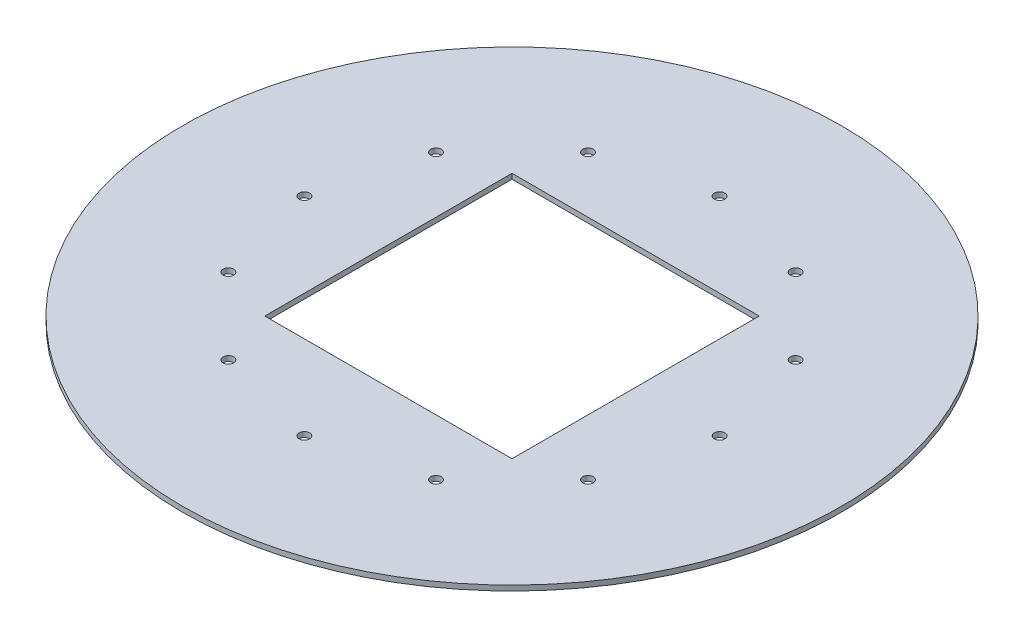
ISO-10303-21;
HEADER;
FILE_DESCRIPTION(('STEP AP214'),'2;1');
FILE_NAME('part.step','',(''),(''),'','','');
FILE_SCHEMA(('AUTOMOTIVE_DESIGN { 1 0 10303 214 1 1 1 1 }'));
ENDSEC;
DATA;
#1=APPLICATION_CONTEXT('core data for automotive mechanical design processes');
#2=APPLICATION_PROTOCOL_DEFINITION('international standard','automotive_design',2000,#1);
#3=PRODUCT_CONTEXT('',#1,'mechanical');
#4=PRODUCT('Part','Part','',(#3));
#5=PRODUCT_RELATED_PRODUCT_CATEGORY('part','',(#4));
#6=PRODUCT_DEFINITION_FORMATION('','',#4);
#7=PRODUCT_DEFINITION_CONTEXT('part definition',#1,'design');
#8=PRODUCT_DEFINITION('design','',#6,#7);
#9=PRODUCT_DEFINITION_SHAPE('','',#8);
#10=(LENGTH_UNIT() NAMED_UNIT(*) SI_UNIT(.MILLI.,.METRE.));
#11=(NAMED_UNIT(*) PLANE_ANGLE_UNIT() SI_UNIT($,.RADIAN.));
#12=(NAMED_UNIT(*) SI_UNIT($,.STERADIAN.) SOLID_ANGLE_UNIT());
#13=UNCERTAINTY_MEASURE_WITH_UNIT(LENGTH_MEASURE(1.E-05),#10,'distance_accuracy_value','');
#14=(GEOMETRIC_REPRESENTATION_CONTEXT(3) GLOBAL_UNCERTAINTY_ASSIGNED_CONTEXT((#13)) GLOBAL_UNIT_ASSIGNED_CONTEXT((#10,
#11,#12)) REPRESENTATION_CONTEXT('',''));
#15=CARTESIAN_POINT('',(0.,0.,0.));
#16=DIRECTION('',(0.,0.,1.));
#17=DIRECTION('',(1.,0.,0.));
#18=AXIS2_PLACEMENT_3D('',#15,#16,#17);
#19=CARTESIAN_POINT('',(-60.,-0.785000000000001,0.));
#20=DIRECTION('',(0.,1.,0.));
#21=DIRECTION('',(0.,0.,1.));
#22=AXIS2_PLACEMENT_3D('',#19,#20,#21);
#23=PLANE('',#22);
#24=CARTESIAN_POINT('',(-54.5596004384197,-0.785000000007585,-31.4999999999999));
#25=DIRECTION('',(0.,1.,0.));
#26=DIRECTION('',(0.86602540378444,0.,0.499999999999998));
#27=AXIS2_PLACEMENT_3D('',#24,#25,#26);
#28=CIRCLE('',#27,1.6);
#29=CARTESIAN_POINT('',(-53.1739597923646,-0.785000000007585,-30.6999999999999));
#30=VERTEX_POINT('',#29);
#31=EDGE_CURVE('E131',#30,#30,#28,.T.);
#32=ORIENTED_EDGE('',*,*,#31,.T.);
#33=EDGE_LOOP('',(#32));
#34=FACE_BOUND('',#33,.T.);
#35=CARTESIAN_POINT('',(-63.,-0.785000000007585,2.19963324347117E-13));
#36=DIRECTION('',(0.,1.,0.));
#37=DIRECTION('',(1.,0.,0.));
#38=AXIS2_PLACEMENT_3D('',#35,#36,#37);
#39=CIRCLE('',#38,1.6);
#40=CARTESIAN_POINT('',(-61.4,-0.785000000007585,2.14376954204968E-13));
#41=VERTEX_POINT('',#40);
#42=EDGE_CURVE('E174',#41,#41,#39,.T.);
#43=ORIENTED_EDGE('',*,*,#42,.T.);
#44=EDGE_LOOP('',(#43));
#45=FACE_BOUND('',#44,.T.);
#46=CARTESIAN_POINT('',(-54.5596004384195,-0.785000000007585,31.5000000000003));
#47=DIRECTION('',(0.,1.,0.));
#48=DIRECTION('',(0.866025403784436,0.,-0.500000000000004));
#49=AXIS2_PLACEMENT_3D('',#46,#47,#48);
#50=CIRCLE('',#49,1.6);
#51=CARTESIAN_POINT('',(-53.1739597923644,-0.785000000007585,30.7000000000002));
#52=VERTEX_POINT('',#51);
#53=EDGE_CURVE('E168',#52,#52,#50,.T.);
#54=ORIENTED_EDGE('',*,*,#53,.T.);
#55=EDGE_LOOP('',(#54));
#56=FACE_BOUND('',#55,.T.);
#57=CARTESIAN_POINT('',(-31.4999999999997,-0.785000000007585,54.5596004384198));
#58=DIRECTION('',(0.,1.,0.));
#59=DIRECTION('',(0.499999999999995,0.,-0.866025403784442));
#60=AXIS2_PLACEMENT_3D('',#57,#58,#59);
#61=CIRCLE('',#60,1.6);
#62=CARTESIAN_POINT('',(-30.6999999999997,-0.785000000007585,53.1739597923647));
#63=VERTEX_POINT('',#62);
#64=EDGE_CURVE('E162',#63,#63,#61,.T.);
#65=ORIENTED_EDGE('',*,*,#64,.T.);
#66=EDGE_LOOP('',(#65));
#67=FACE_BOUND('',#66,.T.);
#68=CARTESIAN_POINT('',(0.,-0.785000000007585,63.));
#69=DIRECTION('',(0.,1.,0.));
#70=DIRECTION('',(0.,0.,-1.));
#71=AXIS2_PLACEMENT_3D('',#68,#69,#70);
#72=CIRCLE('',#71,1.6);
#73=CARTESIAN_POINT('',(0.,-0.785000000007585,61.4));
#74=VERTEX_POINT('',#73);
#75=EDGE_CURVE('E156',#74,#74,#72,.T.);
#76=ORIENTED_EDGE('',*,*,#75,.T.);
#77=EDGE_LOOP('',(#76));
#78=FACE_BOUND('',#77,.T.);
#79=CARTESIAN_POINT('',(31.5000000000005,-0.785000000007585,54.5596004384194));
#80=DIRECTION('',(0.,1.,0.));
#81=DIRECTION('',(-0.500000000000007,0.,-0.866025403784435));
#82=AXIS2_PLACEMENT_3D('',#79,#80,#81);
#83=CIRCLE('',#82,1.6);
#84=CARTESIAN_POINT('',(30.7000000000004,-0.785000000007585,53.1739597923643));
#85=VERTEX_POINT('',#84);
#86=EDGE_CURVE('E150',#85,#85,#83,.T.);
#87=ORIENTED_EDGE('',*,*,#86,.T.);
#88=EDGE_LOOP('',(#87));
#89=FACE_BOUND('',#88,.T.);
#90=CARTESIAN_POINT('',(54.5596004384199,-0.785000000007585,31.4999999999995));
#91=DIRECTION('',(0.,1.,0.));
#92=DIRECTION('',(-0.866025403784443,0.,-0.499999999999992));
#93=AXIS2_PLACEMENT_3D('',#90,#91,#92);
#94=CIRCLE('',#93,1.6);
#95=CARTESIAN_POINT('',(53.1739597923648,-0.785000000007585,30.6999999999995));
#96=VERTEX_POINT('',#95);
#97=EDGE_CURVE('E144',#96,#96,#94,.T.);
#98=ORIENTED_EDGE('',*,*,#97,.T.);
#99=EDGE_LOOP('',(#98));
#100=FACE_BOUND('',#99,.T.);
#101=CARTESIAN_POINT('',(63.,-0.785000000007585,-6.59889973041352E-13));
#102=DIRECTION('',(0.,1.,0.));
#103=DIRECTION('',(-1.,0.,0.));
#104=AXIS2_PLACEMENT_3D('',#101,#102,#103);
#105=CIRCLE('',#104,1.6);
#106=CARTESIAN_POINT('',(61.4,-0.785000000007585,-6.43130862614905E-13));
#107=VERTEX_POINT('',#106);
#108=EDGE_CURVE('E137',#107,#107,#105,.T.);
#109=ORIENTED_EDGE('',*,*,#108,.T.);
#110=EDGE_LOOP('',(#109));
#111=FACE_BOUND('',#110,.T.);
#112=CARTESIAN_POINT('',(54.5596004384193,-0.785000000007585,-31.5000000000006));
#113=DIRECTION('',(0.,1.,0.));
#114=DIRECTION('',(-0.866025403784433,0.,0.50000000000001));
#115=AXIS2_PLACEMENT_3D('',#112,#113,#114);
#116=CIRCLE('',#115,1.6);
#117=CARTESIAN_POINT('',(53.1739597923642,-0.785000000007585,-30.7000000000006));
#118=VERTEX_POINT('',#117);
#119=EDGE_CURVE('E138',#118,#118,#116,.T.);
#120=ORIENTED_EDGE('',*,*,#119,.T.);
#121=EDGE_LOOP('',(#120));
#122=FACE_BOUND('',#121,.T.);
#123=CARTESIAN_POINT('',(31.4999999999993,-0.785000000007585,-54.55960043842));
#124=DIRECTION('',(0.,1.,0.));
#125=DIRECTION('',(-0.499999999999989,0.,0.866025403784445));
#126=AXIS2_PLACEMENT_3D('',#123,#124,#125);
#127=CIRCLE('',#126,1.6);
#128=CARTESIAN_POINT('',(30.6999999999993,-0.785000000007585,-53.1739597923649));
#129=VERTEX_POINT('',#128);
#130=EDGE_CURVE('E185',#129,#129,#127,.T.);
#131=ORIENTED_EDGE('',*,*,#130,.T.);
#132=EDGE_LOOP('',(#131));
#133=FACE_BOUND('',#132,.T.);
#134=CARTESIAN_POINT('',(-31.5000000000001,-0.785000000007585,-54.5596004384196));
#135=DIRECTION('',(0.,1.,0.));
#136=DIRECTION('',(0.500000000000001,0.,0.866025403784438));
#137=AXIS2_PLACEMENT_3D('',#134,#135,#136);
#138=CIRCLE('',#137,1.6);
#139=CARTESIAN_POINT('',(-30.7000000000001,-0.785000000007585,-53.1739597923645));
#140=VERTEX_POINT('',#139);
#141=EDGE_CURVE('E126',#140,#140,#138,.T.);
#142=ORIENTED_EDGE('',*,*,#141,.T.);
#143=EDGE_LOOP('',(#142));
#144=FACE_BOUND('',#143,.T.);
#145=CARTESIAN_POINT('',(0.,-0.785000000007585,-63.));
#146=DIRECTION('',(0.,1.,0.));
#147=DIRECTION('',(0.,0.,1.));
#148=AXIS2_PLACEMENT_3D('',#145,#146,#147);
#149=CIRCLE('',#148,1.6);
#150=CARTESIAN_POINT('',(0.,-0.785000000007585,-61.4));
#151=VERTEX_POINT('',#150);
#152=EDGE_CURVE('E120',#151,#151,#149,.T.);
#153=ORIENTED_EDGE('',*,*,#152,.T.);
#154=EDGE_LOOP('',(#153));
#155=FACE_BOUND('',#154,.T.);
#156=CARTESIAN_POINT('',(0.,-0.785000000007585,0.));
#157=DIRECTION('',(0.,-1.,0.));
#158=DIRECTION('',(0.,0.,-1.));
#159=AXIS2_PLACEMENT_3D('',#156,#157,#158);
#160=CIRCLE('',#159,100.);
#161=CARTESIAN_POINT('',(0.,-0.785000000007585,-100.));
#162=VERTEX_POINT('',#161);
#163=EDGE_CURVE('E11',#162,#162,#160,.T.);
#164=ORIENTED_EDGE('',*,*,#163,.T.);
#165=EDGE_LOOP('',(#164));
#166=FACE_BOUND('',#165,.T.);
#167=DIRECTION('',(1.,0.,0.));
#168=VECTOR('',#167,1.);
#169=CARTESIAN_POINT('',(-37.5,-0.785000000000008,-37.5));
#170=LINE('',#169,#168);
#171=CARTESIAN_POINT('',(-37.5,-0.785000000000008,-37.5));
#172=VERTEX_POINT('',#171);
#173=CARTESIAN_POINT('',(37.5,-0.785000000000008,-37.5));
#174=VERTEX_POINT('',#173);
#175=EDGE_CURVE('E53',#172,#174,#170,.T.);
#176=ORIENTED_EDGE('',*,*,#175,.F.);
#177=DIRECTION('',(0.,0.,-1.));
#178=VECTOR('',#177,1.);
#179=CARTESIAN_POINT('',(-37.5,-0.785000000000008,37.5));
#180=LINE('',#179,#178);
#181=CARTESIAN_POINT('',(-37.5,-0.785000000000008,37.5));
#182=VERTEX_POINT('',#181);
#183=EDGE_CURVE('E57',#182,#172,#180,.T.);
#184=ORIENTED_EDGE('',*,*,#183,.F.);
#185=DIRECTION('',(-1.,0.,0.));
#186=VECTOR('',#185,1.);
#187=CARTESIAN_POINT('',(-37.5,-0.785000000000008,37.5));
#188=LINE('',#187,#186);
#189=CARTESIAN_POINT('',(37.5,-0.785000000000008,37.5));
#190=VERTEX_POINT('',#189);
#191=EDGE_CURVE('E111',#190,#182,#188,.T.);
#192=ORIENTED_EDGE('',*,*,#191,.F.);
#193=DIRECTION('',(0.,0.,1.));
#194=VECTOR('',#193,1.);
#195=CARTESIAN_POINT('',(37.5,-0.785000000000008,37.5));
#196=LINE('',#195,#194);
#197=EDGE_CURVE('E107',#174,#190,#196,.T.);
#198=ORIENTED_EDGE('',*,*,#197,.F.);
#199=EDGE_LOOP('',(#176,#184,#192,#198));
#200=FACE_BOUND('',#199,.T.);
#201=ADVANCED_FACE('F39',(#34,#45,#56,#67,#78,#89,#100,#111,#122,#133,#144,#155,#166,#200),#23,.F.);
#202=CARTESIAN_POINT('',(0.,-200069.047495165,0.));
#203=DIRECTION('',(0.,-1.,0.));
#204=DIRECTION('',(0.,0.,-1.));
#205=AXIS2_PLACEMENT_3D('',#202,#203,#204);
#206=CYLINDRICAL_SURFACE('',#205,100.);
#207=ORIENTED_EDGE('',*,*,#163,.F.);
#208=EDGE_LOOP('',(#207));
#209=FACE_BOUND('',#208,.T.);
#210=CARTESIAN_POINT('',(0.,0.785000000007585,0.));
#211=DIRECTION('',(0.,-1.,0.));
#212=DIRECTION('',(0.,0.,-1.));
#213=AXIS2_PLACEMENT_3D('',#210,#211,#212);
#214=CIRCLE('',#213,100.);
#215=CARTESIAN_POINT('',(0.,0.785000000007585,-100.));
#216=VERTEX_POINT('',#215);
#217=EDGE_CURVE('E46',#216,#216,#214,.T.);
#218=ORIENTED_EDGE('',*,*,#217,.T.);
#219=EDGE_LOOP('',(#218));
#220=FACE_BOUND('',#219,.T.);
#221=ADVANCED_FACE('F206',(#209,#220),#206,.T.);
#222=CARTESIAN_POINT('',(-60.,0.785000000000001,0.));
#223=DIRECTION('',(0.,-1.,0.));
#224=DIRECTION('',(0.,0.,-1.));
#225=AXIS2_PLACEMENT_3D('',#222,#223,#224);
#226=PLANE('',#225);
#227=CARTESIAN_POINT('',(-54.5596004384197,0.785000000000001,-31.4999999999999));
#228=DIRECTION('',(0.,1.,0.));
#229=DIRECTION('',(0.86602540378444,0.,0.499999999999998));
#230=AXIS2_PLACEMENT_3D('',#227,#228,#229);
#231=CIRCLE('',#230,1.6);
#232=CARTESIAN_POINT('',(-53.1739597923646,0.785000000000001,-30.6999999999999));
#233=VERTEX_POINT('',#232);
#234=EDGE_CURVE('E177',#233,#233,#231,.T.);
#235=ORIENTED_EDGE('',*,*,#234,.F.);
#236=EDGE_LOOP('',(#235));
#237=FACE_BOUND('',#236,.T.);
#238=CARTESIAN_POINT('',(-63.,0.785000000000001,2.19963324347117E-13));
#239=DIRECTION('',(0.,1.,0.));
#240=DIRECTION('',(1.,0.,0.));
#241=AXIS2_PLACEMENT_3D('',#238,#239,#240);
#242=CIRCLE('',#241,1.6);
#243=CARTESIAN_POINT('',(-61.4,0.785000000000001,2.14376954204968E-13));
#244=VERTEX_POINT('',#243);
#245=EDGE_CURVE('E171',#244,#244,#242,.T.);
#246=ORIENTED_EDGE('',*,*,#245,.F.);
#247=EDGE_LOOP('',(#246));
#248=FACE_BOUND('',#247,.T.);
#249=CARTESIAN_POINT('',(-54.5596004384195,0.785000000000001,31.5000000000003));
#250=DIRECTION('',(0.,1.,0.));
#251=DIRECTION('',(0.866025403784436,0.,-0.500000000000004));
#252=AXIS2_PLACEMENT_3D('',#249,#250,#251);
#253=CIRCLE('',#252,1.6);
#254=CARTESIAN_POINT('',(-53.1739597923644,0.785000000000001,30.7000000000002));
#255=VERTEX_POINT('',#254);
#256=EDGE_CURVE('E165',#255,#255,#253,.T.);
#257=ORIENTED_EDGE('',*,*,#256,.F.);
#258=EDGE_LOOP('',(#257));
#259=FACE_BOUND('',#258,.T.);
#260=CARTESIAN_POINT('',(-31.4999999999997,0.785000000000001,54.5596004384198));
#261=DIRECTION('',(0.,1.,0.));
#262=DIRECTION('',(0.499999999999995,0.,-0.866025403784442));
#263=AXIS2_PLACEMENT_3D('',#260,#261,#262);
#264=CIRCLE('',#263,1.6);
#265=CARTESIAN_POINT('',(-30.6999999999997,0.785000000000001,53.1739597923647));
#266=VERTEX_POINT('',#265);
#267=EDGE_CURVE('E159',#266,#266,#264,.T.);
#268=ORIENTED_EDGE('',*,*,#267,.F.);
#269=EDGE_LOOP('',(#268));
#270=FACE_BOUND('',#269,.T.);
#271=CARTESIAN_POINT('',(0.,0.785000000000001,63.));
#272=DIRECTION('',(0.,1.,0.));
#273=DIRECTION('',(0.,0.,-1.));
#274=AXIS2_PLACEMENT_3D('',#271,#272,#273);
#275=CIRCLE('',#274,1.6);
#276=CARTESIAN_POINT('',(0.,0.785000000000001,61.4));
#277=VERTEX_POINT('',#276);
#278=EDGE_CURVE('E153',#277,#277,#275,.T.);
#279=ORIENTED_EDGE('',*,*,#278,.F.);
#280=EDGE_LOOP('',(#279));
#281=FACE_BOUND('',#280,.T.);
#282=CARTESIAN_POINT('',(31.5000000000005,0.785000000000001,54.5596004384194));
#283=DIRECTION('',(0.,1.,0.));
#284=DIRECTION('',(-0.500000000000007,0.,-0.866025403784435));
#285=AXIS2_PLACEMENT_3D('',#282,#283,#284);
#286=CIRCLE('',#285,1.6);
#287=CARTESIAN_POINT('',(30.7000000000004,0.785000000000001,53.1739597923643));
#288=VERTEX_POINT('',#287);
#289=EDGE_CURVE('E147',#288,#288,#286,.T.);
#290=ORIENTED_EDGE('',*,*,#289,.F.);
#291=EDGE_LOOP('',(#290));
#292=FACE_BOUND('',#291,.T.);
#293=CARTESIAN_POINT('',(54.5596004384199,0.785000000000001,31.4999999999995));
#294=DIRECTION('',(0.,1.,0.));
#295=DIRECTION('',(-0.866025403784443,0.,-0.499999999999992));
#296=AXIS2_PLACEMENT_3D('',#293,#294,#295);
#297=CIRCLE('',#296,1.6);
#298=CARTESIAN_POINT('',(53.1739597923648,0.785000000000001,30.6999999999995));
#299=VERTEX_POINT('',#298);
#300=EDGE_CURVE('E141',#299,#299,#297,.T.);
#301=ORIENTED_EDGE('',*,*,#300,.F.);
#302=EDGE_LOOP('',(#301));
#303=FACE_BOUND('',#302,.T.);
#304=CARTESIAN_POINT('',(63.,0.785000000000001,-6.59889973041352E-13));
#305=DIRECTION('',(0.,1.,0.));
#306=DIRECTION('',(-1.,0.,0.));
#307=AXIS2_PLACEMENT_3D('',#304,#305,#306);
#308=CIRCLE('',#307,1.6);
#309=CARTESIAN_POINT('',(61.4,0.785000000000001,-6.43130862614905E-13));
#310=VERTEX_POINT('',#309);
#311=EDGE_CURVE('E134',#310,#310,#308,.T.);
#312=ORIENTED_EDGE('',*,*,#311,.F.);
#313=EDGE_LOOP('',(#312));
#314=FACE_BOUND('',#313,.T.);
#315=CARTESIAN_POINT('',(54.5596004384193,0.785000000000001,-31.5000000000006));
#316=DIRECTION('',(0.,1.,0.));
#317=DIRECTION('',(-0.866025403784433,0.,0.50000000000001));
#318=AXIS2_PLACEMENT_3D('',#315,#316,#317);
#319=CIRCLE('',#318,1.6);
#320=CARTESIAN_POINT('',(53.1739597923642,0.785000000000001,-30.7000000000006));
#321=VERTEX_POINT('',#320);
#322=EDGE_CURVE('E188',#321,#321,#319,.T.);
#323=ORIENTED_EDGE('',*,*,#322,.F.);
#324=EDGE_LOOP('',(#323));
#325=FACE_BOUND('',#324,.T.);
#326=CARTESIAN_POINT('',(31.4999999999993,0.785000000000001,-54.55960043842));
#327=DIRECTION('',(0.,1.,0.));
#328=DIRECTION('',(-0.499999999999989,0.,0.866025403784445));
#329=AXIS2_PLACEMENT_3D('',#326,#327,#328);
#330=CIRCLE('',#329,1.6);
#331=CARTESIAN_POINT('',(30.6999999999993,0.785000000000001,-53.1739597923649));
#332=VERTEX_POINT('',#331);
#333=EDGE_CURVE('E182',#332,#332,#330,.T.);
#334=ORIENTED_EDGE('',*,*,#333,.F.);
#335=EDGE_LOOP('',(#334));
#336=FACE_BOUND('',#335,.T.);
#337=CARTESIAN_POINT('',(-31.5000000000001,0.785000000000001,-54.5596004384196));
#338=DIRECTION('',(0.,1.,0.));
#339=DIRECTION('',(0.500000000000001,0.,0.866025403784438));
#340=AXIS2_PLACEMENT_3D('',#337,#338,#339);
#341=CIRCLE('',#340,1.6);
#342=CARTESIAN_POINT('',(-30.7000000000001,0.785000000000001,-53.1739597923645));
#343=VERTEX_POINT('',#342);
#344=EDGE_CURVE('E128',#343,#343,#341,.T.);
#345=ORIENTED_EDGE('',*,*,#344,.F.);
#346=EDGE_LOOP('',(#345));
#347=FACE_BOUND('',#346,.T.);
#348=CARTESIAN_POINT('',(0.,0.785000000000001,-63.));
#349=DIRECTION('',(0.,1.,0.));
#350=DIRECTION('',(0.,0.,1.));
#351=AXIS2_PLACEMENT_3D('',#348,#349,#350);
#352=CIRCLE('',#351,1.6);
#353=CARTESIAN_POINT('',(0.,0.785000000000001,-61.4));
#354=VERTEX_POINT('',#353);
#355=EDGE_CURVE('E116',#354,#354,#352,.T.);
#356=ORIENTED_EDGE('',*,*,#355,.F.);
#357=EDGE_LOOP('',(#356));
#358=FACE_BOUND('',#357,.T.);
#359=ORIENTED_EDGE('',*,*,#217,.F.);
#360=EDGE_LOOP('',(#359));
#361=FACE_BOUND('',#360,.T.);
#362=DIRECTION('',(0.,0.,-1.));
#363=VECTOR('',#362,1.);
#364=CARTESIAN_POINT('',(37.5,0.785000000000001,37.5));
#365=LINE('',#364,#363);
#366=CARTESIAN_POINT('',(37.5,0.785000000000001,37.5));
#367=VERTEX_POINT('',#366);
#368=CARTESIAN_POINT('',(37.5,0.785000000000001,-37.5));
#369=VERTEX_POINT('',#368);
#370=EDGE_CURVE('E94',#367,#369,#365,.T.);
#371=ORIENTED_EDGE('',*,*,#370,.F.);
#372=DIRECTION('',(1.,0.,0.));
#373=VECTOR('',#372,1.);
#374=CARTESIAN_POINT('',(-37.5,0.785000000000001,37.5));
#375=LINE('',#374,#373);
#376=CARTESIAN_POINT('',(-37.5,0.785000000000001,37.5));
#377=VERTEX_POINT('',#376);
#378=EDGE_CURVE('E98',#377,#367,#375,.T.);
#379=ORIENTED_EDGE('',*,*,#378,.F.);
#380=DIRECTION('',(0.,0.,1.));
#381=VECTOR('',#380,1.);
#382=CARTESIAN_POINT('',(-37.5,0.785000000000001,37.5));
#383=LINE('',#382,#381);
#384=CARTESIAN_POINT('',(-37.5,0.785000000000001,-37.5));
#385=VERTEX_POINT('',#384);
#386=EDGE_CURVE('E81',#385,#377,#383,.T.);
#387=ORIENTED_EDGE('',*,*,#386,.F.);
#388=DIRECTION('',(-1.,0.,0.));
#389=VECTOR('',#388,1.);
#390=CARTESIAN_POINT('',(-37.5,0.785000000000001,-37.5));
#391=LINE('',#390,#389);
#392=EDGE_CURVE('E88',#369,#385,#391,.T.);
#393=ORIENTED_EDGE('',*,*,#392,.F.);
#394=EDGE_LOOP('',(#371,#379,#387,#393));
#395=FACE_BOUND('',#394,.T.);
#396=ADVANCED_FACE('F96',(#237,#248,#259,#270,#281,#292,#303,#314,#325,#336,#347,#358,#361,
#395),#226,.F.);
#397=CARTESIAN_POINT('',(-37.5,-170.490627484771,-37.5));
#398=DIRECTION('',(0.,0.,-1.));
#399=DIRECTION('',(-1.,0.,0.));
#400=AXIS2_PLACEMENT_3D('',#397,#398,#399);
#401=PLANE('',#400);
#402=DIRECTION('',(0.,1.,0.));
#403=VECTOR('',#402,1.);
#404=CARTESIAN_POINT('',(-37.5,-170.490627484771,-37.5));
#405=LINE('',#404,#403);
#406=EDGE_CURVE('E77',#172,#385,#405,.T.);
#407=ORIENTED_EDGE('',*,*,#406,.F.);
#408=ORIENTED_EDGE('',*,*,#175,.T.);
#409=DIRECTION('',(0.,1.,0.));
#410=VECTOR('',#409,1.);
#411=CARTESIAN_POINT('',(37.5,-170.490627484771,-37.5));
#412=LINE('',#411,#410);
#413=EDGE_CURVE('E85',#174,#369,#412,.T.);
#414=ORIENTED_EDGE('',*,*,#413,.T.);
#415=ORIENTED_EDGE('',*,*,#392,.T.);
#416=EDGE_LOOP('',(#407,#408,#414,#415));
#417=FACE_BOUND('',#416,.T.);
#418=ADVANCED_FACE('F89',(#417),#401,.F.);
#419=CARTESIAN_POINT('',(-37.5,-170.490627484771,37.5));
#420=DIRECTION('',(-1.,0.,0.));
#421=DIRECTION('',(0.,0.,1.));
#422=AXIS2_PLACEMENT_3D('',#419,#420,#421);
#423=PLANE('',#422);
#424=DIRECTION('',(0.,1.,0.));
#425=VECTOR('',#424,1.);
#426=CARTESIAN_POINT('',(-37.5,-170.490627484771,37.5));
#427=LINE('',#426,#425);
#428=EDGE_CURVE('E84',#182,#377,#427,.T.);
#429=ORIENTED_EDGE('',*,*,#428,.F.);
#430=ORIENTED_EDGE('',*,*,#183,.T.);
#431=ORIENTED_EDGE('',*,*,#406,.T.);
#432=ORIENTED_EDGE('',*,*,#386,.T.);
#433=EDGE_LOOP('',(#429,#430,#431,#432));
#434=FACE_BOUND('',#433,.T.);
#435=ADVANCED_FACE('F79',(#434),#423,.F.);
#436=CARTESIAN_POINT('',(-37.5,-170.490627484771,37.5));
#437=DIRECTION('',(0.,0.,1.));
#438=DIRECTION('',(1.,0.,0.));
#439=AXIS2_PLACEMENT_3D('',#436,#437,#438);
#440=PLANE('',#439);
#441=DIRECTION('',(0.,1.,0.));
#442=VECTOR('',#441,1.);
#443=CARTESIAN_POINT('',(37.5,-170.490627484771,37.5));
#444=LINE('',#443,#442);
#445=EDGE_CURVE('E103',#190,#367,#444,.T.);
#446=ORIENTED_EDGE('',*,*,#445,.F.);
#447=ORIENTED_EDGE('',*,*,#191,.T.);
#448=ORIENTED_EDGE('',*,*,#428,.T.);
#449=ORIENTED_EDGE('',*,*,#378,.T.);
#450=EDGE_LOOP('',(#446,#447,#448,#449));
#451=FACE_BOUND('',#450,.T.);
#452=ADVANCED_FACE('F229',(#451),#440,.F.);
#453=CARTESIAN_POINT('',(37.5,-170.490627484771,37.5));
#454=DIRECTION('',(1.,0.,0.));
#455=DIRECTION('',(0.,0.,-1.));
#456=AXIS2_PLACEMENT_3D('',#453,#454,#455);
#457=PLANE('',#456);
#458=ORIENTED_EDGE('',*,*,#413,.F.);
#459=ORIENTED_EDGE('',*,*,#197,.T.);
#460=ORIENTED_EDGE('',*,*,#445,.T.);
#461=ORIENTED_EDGE('',*,*,#370,.T.);
#462=EDGE_LOOP('',(#458,#459,#460,#461));
#463=FACE_BOUND('',#462,.T.);
#464=ADVANCED_FACE('F219',(#463),#457,.F.);
#465=CARTESIAN_POINT('',(0.,-0.785000000007585,-63.));
#466=DIRECTION('',(0.,1.,0.));
#467=DIRECTION('',(0.,0.,1.));
#468=AXIS2_PLACEMENT_3D('',#465,#466,#467);
#469=CYLINDRICAL_SURFACE('',#468,1.6);
#470=ORIENTED_EDGE('',*,*,#152,.F.);
#471=EDGE_LOOP('',(#470));
#472=FACE_BOUND('',#471,.T.);
#473=ORIENTED_EDGE('',*,*,#355,.T.);
#474=EDGE_LOOP('',(#473));
#475=FACE_BOUND('',#474,.T.);
#476=ADVANCED_FACE('F216',(#472,#475),#469,.F.);
#477=CARTESIAN_POINT('',(-31.5000000000001,-0.785000000007585,-54.5596004384196));
#478=DIRECTION('',(0.,1.,0.));
#479=DIRECTION('',(0.,0.,1.));
#480=AXIS2_PLACEMENT_3D('',#477,#478,#479);
#481=CYLINDRICAL_SURFACE('',#480,1.6);
#482=ORIENTED_EDGE('',*,*,#141,.F.);
#483=EDGE_LOOP('',(#482));
#484=FACE_BOUND('',#483,.T.);
#485=ORIENTED_EDGE('',*,*,#344,.T.);
#486=EDGE_LOOP('',(#485));
#487=FACE_BOUND('',#486,.T.);
#488=ADVANCED_FACE('F218',(#484,#487),#481,.F.);
#489=CARTESIAN_POINT('',(31.4999999999993,-0.785000000007585,-54.55960043842));
#490=DIRECTION('',(0.,1.,0.));
#491=DIRECTION('',(0.,0.,1.));
#492=AXIS2_PLACEMENT_3D('',#489,#490,#491);
#493=CYLINDRICAL_SURFACE('',#492,1.6);
#494=ORIENTED_EDGE('',*,*,#130,.F.);
#495=EDGE_LOOP('',(#494));
#496=FACE_BOUND('',#495,.T.);
#497=ORIENTED_EDGE('',*,*,#333,.T.);
#498=EDGE_LOOP('',(#497));
#499=FACE_BOUND('',#498,.T.);
#500=ADVANCED_FACE('F200',(#496,#499),#493,.F.);
#501=CARTESIAN_POINT('',(54.5596004384193,-0.785000000007585,-31.5000000000006));
#502=DIRECTION('',(0.,1.,0.));
#503=DIRECTION('',(0.,0.,1.));
#504=AXIS2_PLACEMENT_3D('',#501,#502,#503);
#505=CYLINDRICAL_SURFACE('',#504,1.6);
#506=ORIENTED_EDGE('',*,*,#119,.F.);
#507=EDGE_LOOP('',(#506));
#508=FACE_BOUND('',#507,.T.);
#509=ORIENTED_EDGE('',*,*,#322,.T.);
#510=EDGE_LOOP('',(#509));
#511=FACE_BOUND('',#510,.T.);
#512=ADVANCED_FACE('F196',(#508,#511),#505,.F.);
#513=CARTESIAN_POINT('',(63.,-0.785000000007585,-6.59889973041352E-13));
#514=DIRECTION('',(0.,1.,0.));
#515=DIRECTION('',(0.,0.,1.));
#516=AXIS2_PLACEMENT_3D('',#513,#514,#515);
#517=CYLINDRICAL_SURFACE('',#516,1.6);
#518=ORIENTED_EDGE('',*,*,#108,.F.);
#519=EDGE_LOOP('',(#518));
#520=FACE_BOUND('',#519,.T.);
#521=ORIENTED_EDGE('',*,*,#311,.T.);
#522=EDGE_LOOP('',(#521));
#523=FACE_BOUND('',#522,.T.);
#524=ADVANCED_FACE('F199',(#520,#523),#517,.F.);
#525=CARTESIAN_POINT('',(54.5596004384199,-0.785000000007585,31.4999999999995));
#526=DIRECTION('',(0.,1.,0.));
#527=DIRECTION('',(0.,0.,1.));
#528=AXIS2_PLACEMENT_3D('',#525,#526,#527);
#529=CYLINDRICAL_SURFACE('',#528,1.6);
#530=ORIENTED_EDGE('',*,*,#97,.F.);
#531=EDGE_LOOP('',(#530));
#532=FACE_BOUND('',#531,.T.);
#533=ORIENTED_EDGE('',*,*,#300,.T.);
#534=EDGE_LOOP('',(#533));
#535=FACE_BOUND('',#534,.T.);
#536=ADVANCED_FACE('F255',(#532,#535),#529,.F.);
#537=CARTESIAN_POINT('',(31.5000000000005,-0.785000000007585,54.5596004384194));
#538=DIRECTION('',(0.,1.,0.));
#539=DIRECTION('',(0.,0.,1.));
#540=AXIS2_PLACEMENT_3D('',#537,#538,#539);
#541=CYLINDRICAL_SURFACE('',#540,1.6);
#542=ORIENTED_EDGE('',*,*,#86,.F.);
#543=EDGE_LOOP('',(#542));
#544=FACE_BOUND('',#543,.T.);
#545=ORIENTED_EDGE('',*,*,#289,.T.);
#546=EDGE_LOOP('',(#545));
#547=FACE_BOUND('',#546,.T.);
#548=ADVANCED_FACE('F262',(#544,#547),#541,.F.);
#549=CARTESIAN_POINT('',(0.,-0.785000000007585,63.));
#550=DIRECTION('',(0.,1.,0.));
#551=DIRECTION('',(0.,0.,1.));
#552=AXIS2_PLACEMENT_3D('',#549,#550,#551);
#553=CYLINDRICAL_SURFACE('',#552,1.6);
#554=ORIENTED_EDGE('',*,*,#75,.F.);
#555=EDGE_LOOP('',(#554));
#556=FACE_BOUND('',#555,.T.);
#557=ORIENTED_EDGE('',*,*,#278,.T.);
#558=EDGE_LOOP('',(#557));
#559=FACE_BOUND('',#558,.T.);
#560=ADVANCED_FACE('F268',(#556,#559),#553,.F.);
#561=CARTESIAN_POINT('',(-31.4999999999997,-0.785000000007585,54.5596004384198));
#562=DIRECTION('',(0.,1.,0.));
#563=DIRECTION('',(0.,0.,1.));
#564=AXIS2_PLACEMENT_3D('',#561,#562,#563);
#565=CYLINDRICAL_SURFACE('',#564,1.6);
#566=ORIENTED_EDGE('',*,*,#64,.F.);
#567=EDGE_LOOP('',(#566));
#568=FACE_BOUND('',#567,.T.);
#569=ORIENTED_EDGE('',*,*,#267,.T.);
#570=EDGE_LOOP('',(#569));
#571=FACE_BOUND('',#570,.T.);
#572=ADVANCED_FACE('F272',(#568,#571),#565,.F.);
#573=CARTESIAN_POINT('',(-54.5596004384195,-0.785000000007585,31.5000000000003));
#574=DIRECTION('',(0.,1.,0.));
#575=DIRECTION('',(0.,0.,1.));
#576=AXIS2_PLACEMENT_3D('',#573,#574,#575);
#577=CYLINDRICAL_SURFACE('',#576,1.6);
#578=ORIENTED_EDGE('',*,*,#53,.F.);
#579=EDGE_LOOP('',(#578));
#580=FACE_BOUND('',#579,.T.);
#581=ORIENTED_EDGE('',*,*,#256,.T.);
#582=EDGE_LOOP('',(#581));
#583=FACE_BOUND('',#582,.T.);
#584=ADVANCED_FACE('F276',(#580,#583),#577,.F.);
#585=CARTESIAN_POINT('',(-63.,-0.785000000007585,2.19963324347117E-13));
#586=DIRECTION('',(0.,1.,0.));
#587=DIRECTION('',(0.,0.,1.));
#588=AXIS2_PLACEMENT_3D('',#585,#586,#587);
#589=CYLINDRICAL_SURFACE('',#588,1.6);
#590=ORIENTED_EDGE('',*,*,#42,.F.);
#591=EDGE_LOOP('',(#590));
#592=FACE_BOUND('',#591,.T.);
#593=ORIENTED_EDGE('',*,*,#245,.T.);
#594=EDGE_LOOP('',(#593));
#595=FACE_BOUND('',#594,.T.);
#596=ADVANCED_FACE('F280',(#592,#595),#589,.F.);
#597=CARTESIAN_POINT('',(-54.5596004384197,-0.785000000007585,-31.4999999999999));
#598=DIRECTION('',(0.,1.,0.));
#599=DIRECTION('',(0.,0.,1.));
#600=AXIS2_PLACEMENT_3D('',#597,#598,#599);
#601=CYLINDRICAL_SURFACE('',#600,1.6);
#602=ORIENTED_EDGE('',*,*,#31,.F.);
#603=EDGE_LOOP('',(#602));
#604=FACE_BOUND('',#603,.T.);
#605=ORIENTED_EDGE('',*,*,#234,.T.);
#606=EDGE_LOOP('',(#605));
#607=FACE_BOUND('',#606,.T.);
#608=ADVANCED_FACE('F284',(#604,#607),#601,.F.);
#609=CLOSED_SHELL('',(#201,#221,#396,#418,#435,#452,#464,#476,#488,#500,#512,#524,#536,#548,
#560,#572,#584,#596,#608));
#610=MANIFOLD_SOLID_BREP('B2',#609);
#611=ADVANCED_BREP_SHAPE_REPRESENTATION('',(#18,#610),#14);
#612=SHAPE_DEFINITION_REPRESENTATION(#9,#611);
ENDSEC;
END-ISO-10303-21;
